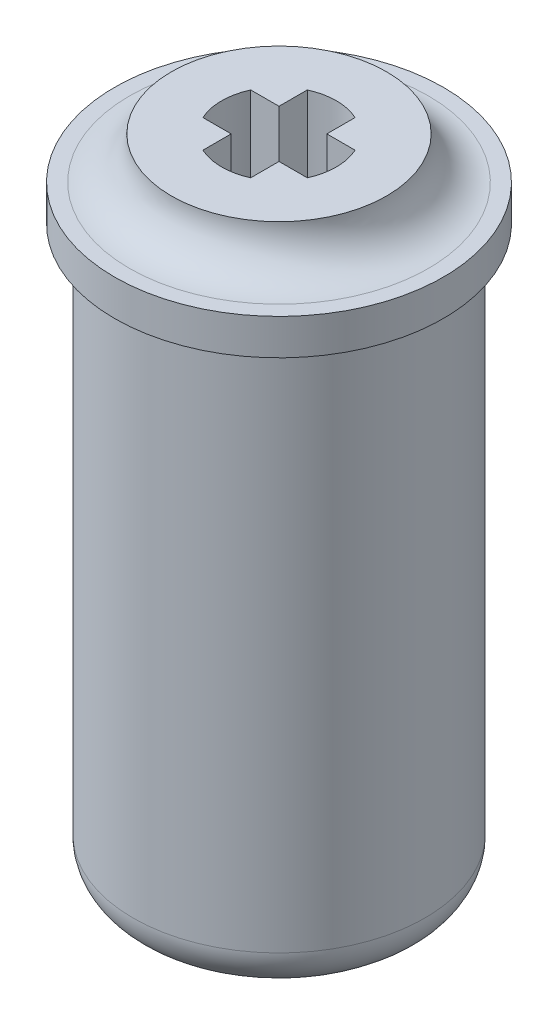
ISO-10303-21;
HEADER;
FILE_DESCRIPTION(('STEP AP214'),'2;1');
FILE_NAME('part.step','',(''),(''),'','','');
FILE_SCHEMA(('AUTOMOTIVE_DESIGN { 1 0 10303 214 1 1 1 1 }'));
ENDSEC;
DATA;
#1=APPLICATION_CONTEXT('core data for automotive mechanical design processes');
#2=APPLICATION_PROTOCOL_DEFINITION('international standard','automotive_design',2000,#1);
#3=PRODUCT_CONTEXT('',#1,'mechanical');
#4=PRODUCT('Part','Part','',(#3));
#5=PRODUCT_RELATED_PRODUCT_CATEGORY('part','',(#4));
#6=PRODUCT_DEFINITION_FORMATION('','',#4);
#7=PRODUCT_DEFINITION_CONTEXT('part definition',#1,'design');
#8=PRODUCT_DEFINITION('design','',#6,#7);
#9=PRODUCT_DEFINITION_SHAPE('','',#8);
#10=(LENGTH_UNIT() NAMED_UNIT(*) SI_UNIT(.MILLI.,.METRE.));
#11=(NAMED_UNIT(*) PLANE_ANGLE_UNIT() SI_UNIT($,.RADIAN.));
#12=(NAMED_UNIT(*) SI_UNIT($,.STERADIAN.) SOLID_ANGLE_UNIT());
#13=UNCERTAINTY_MEASURE_WITH_UNIT(LENGTH_MEASURE(1.E-05),#10,'distance_accuracy_value','');
#14=(GEOMETRIC_REPRESENTATION_CONTEXT(3) GLOBAL_UNCERTAINTY_ASSIGNED_CONTEXT((#13)) GLOBAL_UNIT_ASSIGNED_CONTEXT((#10,
#11,#12)) REPRESENTATION_CONTEXT('',''));
#15=CARTESIAN_POINT('',(0.,0.,0.));
#16=DIRECTION('',(0.,0.,1.));
#17=DIRECTION('',(1.,0.,0.));
#18=AXIS2_PLACEMENT_3D('',#15,#16,#17);
#19=CARTESIAN_POINT('',(1.59087121146357,-25.25,1.59087121146357));
#20=DIRECTION('',(0.,-1.,0.));
#21=DIRECTION('',(0.,0.,-1.));
#22=AXIS2_PLACEMENT_3D('',#19,#20,#21);
#23=PLANE('',#22);
#24=CARTESIAN_POINT('',(0.,-25.25,0.));
#25=DIRECTION('',(0.,-1.,0.));
#26=DIRECTION('',(0.,0.,-1.));
#27=AXIS2_PLACEMENT_3D('',#24,#25,#26);
#28=CIRCLE('',#27,2.4);
#29=CARTESIAN_POINT('',(2.18174242292714,-25.25,1.));
#30=VERTEX_POINT('',#29);
#31=CARTESIAN_POINT('',(0.999999999999999,-25.25,2.18174242292714));
#32=VERTEX_POINT('',#31);
#33=EDGE_CURVE('E218',#30,#32,#28,.T.);
#34=ORIENTED_EDGE('',*,*,#33,.T.);
#35=DIRECTION('',(0.,0.,-1.));
#36=VECTOR('',#35,1.);
#37=CARTESIAN_POINT('',(1.,-25.25,1.));
#38=LINE('',#37,#36);
#39=CARTESIAN_POINT('',(1.,-25.25,1.));
#40=VERTEX_POINT('',#39);
#41=EDGE_CURVE('E210',#32,#40,#38,.T.);
#42=ORIENTED_EDGE('',*,*,#41,.T.);
#43=DIRECTION('',(1.,0.,0.));
#44=VECTOR('',#43,1.);
#45=CARTESIAN_POINT('',(2.18174242292714,-25.25,1.));
#46=LINE('',#45,#44);
#47=EDGE_CURVE('E222',#40,#30,#46,.T.);
#48=ORIENTED_EDGE('',*,*,#47,.T.);
#49=EDGE_LOOP('',(#34,#42,#48));
#50=FACE_BOUND('',#49,.T.);
#51=ADVANCED_FACE('F16',(#50),#23,.T.);
#52=CARTESIAN_POINT('',(1.,1.75,1.));
#53=DIRECTION('',(1.,0.,0.));
#54=DIRECTION('',(0.,0.,-1.));
#55=AXIS2_PLACEMENT_3D('',#52,#53,#54);
#56=PLANE('',#55);
#57=DIRECTION('',(0.,-1.,0.));
#58=VECTOR('',#57,1.);
#59=CARTESIAN_POINT('',(0.999999999999998,1.75,2.18174242292715));
#60=LINE('',#59,#58);
#61=CARTESIAN_POINT('',(0.999999999999999,1.75,2.18174242292714));
#62=VERTEX_POINT('',#61);
#63=EDGE_CURVE('E216',#32,#62,#60,.F.);
#64=ORIENTED_EDGE('',*,*,#63,.T.);
#65=DIRECTION('',(0.,0.,1.));
#66=VECTOR('',#65,1.);
#67=CARTESIAN_POINT('',(1.,1.75,0.));
#68=LINE('',#67,#66);
#69=CARTESIAN_POINT('',(1.,1.75,1.));
#70=VERTEX_POINT('',#69);
#71=EDGE_CURVE('E126',#70,#62,#68,.T.);
#72=ORIENTED_EDGE('',*,*,#71,.F.);
#73=DIRECTION('',(0.,1.,0.));
#74=VECTOR('',#73,1.);
#75=CARTESIAN_POINT('',(1.,1.75,1.));
#76=LINE('',#75,#74);
#77=EDGE_CURVE('E225',#70,#40,#76,.F.);
#78=ORIENTED_EDGE('',*,*,#77,.T.);
#79=ORIENTED_EDGE('',*,*,#41,.F.);
#80=EDGE_LOOP('',(#64,#72,#78,#79));
#81=FACE_BOUND('',#80,.T.);
#82=ADVANCED_FACE('F374',(#81),#56,.F.);
#83=CARTESIAN_POINT('',(-1.,1.75,2.18174242292714));
#84=DIRECTION('',(-1.,0.,0.));
#85=DIRECTION('',(0.,0.,1.));
#86=AXIS2_PLACEMENT_3D('',#83,#84,#85);
#87=PLANE('',#86);
#88=DIRECTION('',(0.,1.,0.));
#89=VECTOR('',#88,1.);
#90=CARTESIAN_POINT('',(-1.,1.75,1.));
#91=LINE('',#90,#89);
#92=CARTESIAN_POINT('',(-1.,-25.25,1.));
#93=VERTEX_POINT('',#92);
#94=CARTESIAN_POINT('',(-1.,1.75,1.));
#95=VERTEX_POINT('',#94);
#96=EDGE_CURVE('E204',#93,#95,#91,.T.);
#97=ORIENTED_EDGE('',*,*,#96,.T.);
#98=DIRECTION('',(0.,0.,1.));
#99=VECTOR('',#98,1.);
#100=CARTESIAN_POINT('',(-1.,1.75,0.));
#101=LINE('',#100,#99);
#102=CARTESIAN_POINT('',(-1.,1.75,2.18174242292714));
#103=VERTEX_POINT('',#102);
#104=EDGE_CURVE('E173',#103,#95,#101,.F.);
#105=ORIENTED_EDGE('',*,*,#104,.F.);
#106=DIRECTION('',(0.,-1.,0.));
#107=VECTOR('',#106,1.);
#108=CARTESIAN_POINT('',(-1.,1.75,2.18174242292714));
#109=LINE('',#108,#107);
#110=CARTESIAN_POINT('',(-1.,-25.25,2.18174242292714));
#111=VERTEX_POINT('',#110);
#112=EDGE_CURVE('E213',#103,#111,#109,.T.);
#113=ORIENTED_EDGE('',*,*,#112,.T.);
#114=DIRECTION('',(0.,0.,-1.));
#115=VECTOR('',#114,1.);
#116=CARTESIAN_POINT('',(-1.,-25.25,1.59087121146357));
#117=LINE('',#116,#115);
#118=EDGE_CURVE('E207',#93,#111,#117,.F.);
#119=ORIENTED_EDGE('',*,*,#118,.F.);
#120=EDGE_LOOP('',(#97,#105,#113,#119));
#121=FACE_BOUND('',#120,.T.);
#122=ADVANCED_FACE('F370',(#121),#87,.F.);
#123=CARTESIAN_POINT('',(-1.59087121146357,-25.25,1.59087121146357));
#124=DIRECTION('',(0.,-1.,0.));
#125=DIRECTION('',(0.,0.,-1.));
#126=AXIS2_PLACEMENT_3D('',#123,#124,#125);
#127=PLANE('',#126);
#128=CARTESIAN_POINT('',(0.,-25.25,0.));
#129=DIRECTION('',(0.,-1.,0.));
#130=DIRECTION('',(0.,0.,-1.));
#131=AXIS2_PLACEMENT_3D('',#128,#129,#130);
#132=CIRCLE('',#131,2.4);
#133=CARTESIAN_POINT('',(-2.18174242292714,-25.25,1.));
#134=VERTEX_POINT('',#133);
#135=EDGE_CURVE('E201',#111,#134,#132,.T.);
#136=ORIENTED_EDGE('',*,*,#135,.T.);
#137=DIRECTION('',(1.,0.,0.));
#138=VECTOR('',#137,1.);
#139=CARTESIAN_POINT('',(-1.,-25.25,1.));
#140=LINE('',#139,#138);
#141=EDGE_CURVE('E193',#134,#93,#140,.T.);
#142=ORIENTED_EDGE('',*,*,#141,.T.);
#143=ORIENTED_EDGE('',*,*,#118,.T.);
#144=EDGE_LOOP('',(#136,#142,#143));
#145=FACE_BOUND('',#144,.T.);
#146=ADVANCED_FACE('F368',(#145),#127,.T.);
#147=CARTESIAN_POINT('',(-1.,1.75,1.));
#148=DIRECTION('',(0.,0.,1.));
#149=DIRECTION('',(1.,0.,0.));
#150=AXIS2_PLACEMENT_3D('',#147,#148,#149);
#151=PLANE('',#150);
#152=DIRECTION('',(0.,-1.,0.));
#153=VECTOR('',#152,1.);
#154=CARTESIAN_POINT('',(-2.18174242292714,1.75,1.));
#155=LINE('',#154,#153);
#156=CARTESIAN_POINT('',(-2.18174242292714,1.75,1.));
#157=VERTEX_POINT('',#156);
#158=EDGE_CURVE('E199',#134,#157,#155,.F.);
#159=ORIENTED_EDGE('',*,*,#158,.T.);
#160=DIRECTION('',(1.,0.,0.));
#161=VECTOR('',#160,1.);
#162=CARTESIAN_POINT('',(0.,1.75,1.));
#163=LINE('',#162,#161);
#164=EDGE_CURVE('E168',#95,#157,#163,.F.);
#165=ORIENTED_EDGE('',*,*,#164,.F.);
#166=ORIENTED_EDGE('',*,*,#96,.F.);
#167=ORIENTED_EDGE('',*,*,#141,.F.);
#168=EDGE_LOOP('',(#159,#165,#166,#167));
#169=FACE_BOUND('',#168,.T.);
#170=ADVANCED_FACE('F362',(#169),#151,.F.);
#171=CARTESIAN_POINT('',(-2.18174242292714,1.75,-1.));
#172=DIRECTION('',(0.,0.,-1.));
#173=DIRECTION('',(-1.,0.,0.));
#174=AXIS2_PLACEMENT_3D('',#171,#172,#173);
#175=PLANE('',#174);
#176=DIRECTION('',(0.,1.,0.));
#177=VECTOR('',#176,1.);
#178=CARTESIAN_POINT('',(-1.,1.75,-1.));
#179=LINE('',#178,#177);
#180=CARTESIAN_POINT('',(-1.,-25.25,-1.));
#181=VERTEX_POINT('',#180);
#182=CARTESIAN_POINT('',(-1.,1.75,-1.));
#183=VERTEX_POINT('',#182);
#184=EDGE_CURVE('E187',#181,#183,#179,.T.);
#185=ORIENTED_EDGE('',*,*,#184,.T.);
#186=DIRECTION('',(1.,0.,0.));
#187=VECTOR('',#186,1.);
#188=CARTESIAN_POINT('',(0.,1.75,-1.));
#189=LINE('',#188,#187);
#190=CARTESIAN_POINT('',(-2.18174242292714,1.75,-1.));
#191=VERTEX_POINT('',#190);
#192=EDGE_CURVE('E163',#191,#183,#189,.T.);
#193=ORIENTED_EDGE('',*,*,#192,.F.);
#194=DIRECTION('',(0.,-1.,0.));
#195=VECTOR('',#194,1.);
#196=CARTESIAN_POINT('',(-2.18174242292714,1.75,-1.));
#197=LINE('',#196,#195);
#198=CARTESIAN_POINT('',(-2.18174242292714,-25.25,-1.));
#199=VERTEX_POINT('',#198);
#200=EDGE_CURVE('E196',#191,#199,#197,.T.);
#201=ORIENTED_EDGE('',*,*,#200,.T.);
#202=DIRECTION('',(1.,0.,0.));
#203=VECTOR('',#202,1.);
#204=CARTESIAN_POINT('',(-1.59087121146357,-25.25,-1.));
#205=LINE('',#204,#203);
#206=EDGE_CURVE('E190',#181,#199,#205,.F.);
#207=ORIENTED_EDGE('',*,*,#206,.F.);
#208=EDGE_LOOP('',(#185,#193,#201,#207));
#209=FACE_BOUND('',#208,.T.);
#210=ADVANCED_FACE('F358',(#209),#175,.F.);
#211=CARTESIAN_POINT('',(-1.59087121146357,-25.25,-1.59087121146357));
#212=DIRECTION('',(0.,-1.,0.));
#213=DIRECTION('',(0.,0.,-1.));
#214=AXIS2_PLACEMENT_3D('',#211,#212,#213);
#215=PLANE('',#214);
#216=CARTESIAN_POINT('',(0.,-25.25,0.));
#217=DIRECTION('',(0.,-1.,0.));
#218=DIRECTION('',(0.,0.,-1.));
#219=AXIS2_PLACEMENT_3D('',#216,#217,#218);
#220=CIRCLE('',#219,2.4);
#221=CARTESIAN_POINT('',(-1.,-25.25,-2.18174242292714));
#222=VERTEX_POINT('',#221);
#223=EDGE_CURVE('E184',#199,#222,#220,.T.);
#224=ORIENTED_EDGE('',*,*,#223,.T.);
#225=DIRECTION('',(0.,0.,1.));
#226=VECTOR('',#225,1.);
#227=CARTESIAN_POINT('',(-1.,-25.25,-1.));
#228=LINE('',#227,#226);
#229=EDGE_CURVE('E178',#222,#181,#228,.T.);
#230=ORIENTED_EDGE('',*,*,#229,.T.);
#231=ORIENTED_EDGE('',*,*,#206,.T.);
#232=EDGE_LOOP('',(#224,#230,#231));
#233=FACE_BOUND('',#232,.T.);
#234=ADVANCED_FACE('F353',(#233),#215,.T.);
#235=CARTESIAN_POINT('',(-1.,1.75,-1.));
#236=DIRECTION('',(-1.,0.,0.));
#237=DIRECTION('',(0.,0.,1.));
#238=AXIS2_PLACEMENT_3D('',#235,#236,#237);
#239=PLANE('',#238);
#240=DIRECTION('',(0.,-1.,0.));
#241=VECTOR('',#240,1.);
#242=CARTESIAN_POINT('',(-1.,1.75,-2.18174242292714));
#243=LINE('',#242,#241);
#244=CARTESIAN_POINT('',(-1.,1.75,-2.18174242292714));
#245=VERTEX_POINT('',#244);
#246=EDGE_CURVE('E181',#222,#245,#243,.F.);
#247=ORIENTED_EDGE('',*,*,#246,.T.);
#248=DIRECTION('',(0.,0.,1.));
#249=VECTOR('',#248,1.);
#250=CARTESIAN_POINT('',(-1.,1.75,0.));
#251=LINE('',#250,#249);
#252=EDGE_CURVE('E127',#183,#245,#251,.F.);
#253=ORIENTED_EDGE('',*,*,#252,.F.);
#254=ORIENTED_EDGE('',*,*,#184,.F.);
#255=ORIENTED_EDGE('',*,*,#229,.F.);
#256=EDGE_LOOP('',(#247,#253,#254,#255));
#257=FACE_BOUND('',#256,.T.);
#258=ADVANCED_FACE('F350',(#257),#239,.F.);
#259=CARTESIAN_POINT('',(0.,1.75,0.));
#260=DIRECTION('',(0.,1.,0.));
#261=DIRECTION('',(0.,0.,1.));
#262=AXIS2_PLACEMENT_3D('',#259,#260,#261);
#263=PLANE('',#262);
#264=ORIENTED_EDGE('',*,*,#71,.T.);
#265=CARTESIAN_POINT('',(0.,1.75,0.));
#266=DIRECTION('',(0.,-1.,0.));
#267=DIRECTION('',(0.,0.,-1.));
#268=AXIS2_PLACEMENT_3D('',#265,#266,#267);
#269=CIRCLE('',#268,2.4);
#270=EDGE_CURVE('E215',#62,#103,#269,.T.);
#271=ORIENTED_EDGE('',*,*,#270,.T.);
#272=ORIENTED_EDGE('',*,*,#104,.T.);
#273=ORIENTED_EDGE('',*,*,#164,.T.);
#274=CARTESIAN_POINT('',(0.,1.75,0.));
#275=DIRECTION('',(0.,-1.,0.));
#276=DIRECTION('',(0.,0.,-1.));
#277=AXIS2_PLACEMENT_3D('',#274,#275,#276);
#278=CIRCLE('',#277,2.4);
#279=EDGE_CURVE('E198',#157,#191,#278,.T.);
#280=ORIENTED_EDGE('',*,*,#279,.T.);
#281=ORIENTED_EDGE('',*,*,#192,.T.);
#282=ORIENTED_EDGE('',*,*,#252,.T.);
#283=CARTESIAN_POINT('',(0.,1.75,0.));
#284=DIRECTION('',(0.,-1.,0.));
#285=DIRECTION('',(0.,0.,-1.));
#286=AXIS2_PLACEMENT_3D('',#283,#284,#285);
#287=CIRCLE('',#286,2.4);
#288=CARTESIAN_POINT('',(1.,1.75,-2.18174242292714));
#289=VERTEX_POINT('',#288);
#290=EDGE_CURVE('E183',#245,#289,#287,.T.);
#291=ORIENTED_EDGE('',*,*,#290,.T.);
#292=DIRECTION('',(0.,0.,-1.));
#293=VECTOR('',#292,1.);
#294=CARTESIAN_POINT('',(1.,1.75,-2.18174242292714));
#295=LINE('',#294,#293);
#296=CARTESIAN_POINT('',(1.,1.75,-1.));
#297=VERTEX_POINT('',#296);
#298=EDGE_CURVE('E134',#289,#297,#295,.F.);
#299=ORIENTED_EDGE('',*,*,#298,.T.);
#300=DIRECTION('',(-1.,0.,0.));
#301=VECTOR('',#300,1.);
#302=CARTESIAN_POINT('',(1.,1.75,-1.));
#303=LINE('',#302,#301);
#304=CARTESIAN_POINT('',(2.18174242292714,1.75,-1.));
#305=VERTEX_POINT('',#304);
#306=EDGE_CURVE('E129',#297,#305,#303,.F.);
#307=ORIENTED_EDGE('',*,*,#306,.T.);
#308=CARTESIAN_POINT('',(0.,1.75,0.));
#309=DIRECTION('',(0.,-1.,0.));
#310=DIRECTION('',(0.,0.,-1.));
#311=AXIS2_PLACEMENT_3D('',#308,#309,#310);
#312=CIRCLE('',#311,2.4);
#313=CARTESIAN_POINT('',(2.18174242292714,1.75,1.));
#314=VERTEX_POINT('',#313);
#315=EDGE_CURVE('E19',#305,#314,#312,.T.);
#316=ORIENTED_EDGE('',*,*,#315,.T.);
#317=DIRECTION('',(1.,0.,0.));
#318=VECTOR('',#317,1.);
#319=CARTESIAN_POINT('',(2.18174242292714,1.75,1.));
#320=LINE('',#319,#318);
#321=EDGE_CURVE('E230',#314,#70,#320,.F.);
#322=ORIENTED_EDGE('',*,*,#321,.T.);
#323=EDGE_LOOP('',(#264,#271,#272,#273,#280,#281,#282,#291,#299,#307,#316,#322));
#324=FACE_BOUND('',#323,.T.);
#325=CARTESIAN_POINT('',(0.,1.75,0.));
#326=DIRECTION('',(0.,1.,0.));
#327=DIRECTION('',(0.,0.,1.));
#328=AXIS2_PLACEMENT_3D('',#325,#326,#327);
#329=CIRCLE('',#328,4.49999999999999);
#330=CARTESIAN_POINT('',(0.,1.75,4.49999999999999));
#331=VERTEX_POINT('',#330);
#332=EDGE_CURVE('E224',#331,#331,#329,.T.);
#333=ORIENTED_EDGE('',*,*,#332,.T.);
#334=EDGE_LOOP('',(#333));
#335=FACE_BOUND('',#334,.T.);
#336=ADVANCED_FACE('F131',(#324,#335),#263,.T.);
#337=CARTESIAN_POINT('',(1.,1.75,-2.18174242292714));
#338=DIRECTION('',(1.,0.,0.));
#339=DIRECTION('',(0.,0.,-1.));
#340=AXIS2_PLACEMENT_3D('',#337,#338,#339);
#341=PLANE('',#340);
#342=DIRECTION('',(0.,1.,0.));
#343=VECTOR('',#342,1.);
#344=CARTESIAN_POINT('',(1.,1.75,-1.));
#345=LINE('',#344,#343);
#346=CARTESIAN_POINT('',(1.,-25.25,-1.));
#347=VERTEX_POINT('',#346);
#348=EDGE_CURVE('E139',#347,#297,#345,.T.);
#349=ORIENTED_EDGE('',*,*,#348,.T.);
#350=ORIENTED_EDGE('',*,*,#298,.F.);
#351=DIRECTION('',(0.,-1.,0.));
#352=VECTOR('',#351,1.);
#353=CARTESIAN_POINT('',(1.,1.75,-2.18174242292714));
#354=LINE('',#353,#352);
#355=CARTESIAN_POINT('',(1.,-25.25,-2.18174242292714));
#356=VERTEX_POINT('',#355);
#357=EDGE_CURVE('E148',#289,#356,#354,.T.);
#358=ORIENTED_EDGE('',*,*,#357,.T.);
#359=DIRECTION('',(0.,0.,-1.));
#360=VECTOR('',#359,1.);
#361=CARTESIAN_POINT('',(1.,-25.25,-1.59087121146357));
#362=LINE('',#361,#360);
#363=EDGE_CURVE('E155',#347,#356,#362,.T.);
#364=ORIENTED_EDGE('',*,*,#363,.F.);
#365=EDGE_LOOP('',(#349,#350,#358,#364));
#366=FACE_BOUND('',#365,.T.);
#367=ADVANCED_FACE('F342',(#366),#341,.F.);
#368=CARTESIAN_POINT('',(1.59087121146357,-25.25,-1.59087121146357));
#369=DIRECTION('',(0.,-1.,0.));
#370=DIRECTION('',(0.,0.,-1.));
#371=AXIS2_PLACEMENT_3D('',#368,#369,#370);
#372=PLANE('',#371);
#373=CARTESIAN_POINT('',(0.,-25.25,0.));
#374=DIRECTION('',(0.,-1.,0.));
#375=DIRECTION('',(0.,0.,-1.));
#376=AXIS2_PLACEMENT_3D('',#373,#374,#375);
#377=CIRCLE('',#376,2.4);
#378=CARTESIAN_POINT('',(2.18174242292714,-25.25,-1.));
#379=VERTEX_POINT('',#378);
#380=EDGE_CURVE('E144',#356,#379,#377,.T.);
#381=ORIENTED_EDGE('',*,*,#380,.T.);
#382=DIRECTION('',(-1.,0.,0.));
#383=VECTOR('',#382,1.);
#384=CARTESIAN_POINT('',(1.,-25.25,-1.));
#385=LINE('',#384,#383);
#386=EDGE_CURVE('E138',#379,#347,#385,.T.);
#387=ORIENTED_EDGE('',*,*,#386,.T.);
#388=ORIENTED_EDGE('',*,*,#363,.T.);
#389=EDGE_LOOP('',(#381,#387,#388));
#390=FACE_BOUND('',#389,.T.);
#391=ADVANCED_FACE('F340',(#390),#372,.T.);
#392=CARTESIAN_POINT('',(1.,1.75,-1.));
#393=DIRECTION('',(0.,0.,-1.));
#394=DIRECTION('',(-1.,0.,0.));
#395=AXIS2_PLACEMENT_3D('',#392,#393,#394);
#396=PLANE('',#395);
#397=DIRECTION('',(0.,-1.,0.));
#398=VECTOR('',#397,1.);
#399=CARTESIAN_POINT('',(2.18174242292714,1.75,-1.));
#400=LINE('',#399,#398);
#401=EDGE_CURVE('E122',#379,#305,#400,.F.);
#402=ORIENTED_EDGE('',*,*,#401,.T.);
#403=ORIENTED_EDGE('',*,*,#306,.F.);
#404=ORIENTED_EDGE('',*,*,#348,.F.);
#405=ORIENTED_EDGE('',*,*,#386,.F.);
#406=EDGE_LOOP('',(#402,#403,#404,#405));
#407=FACE_BOUND('',#406,.T.);
#408=ADVANCED_FACE('F142',(#407),#396,.F.);
#409=CARTESIAN_POINT('',(2.18174242292714,1.75,1.));
#410=DIRECTION('',(0.,0.,1.));
#411=DIRECTION('',(1.,0.,0.));
#412=AXIS2_PLACEMENT_3D('',#409,#410,#411);
#413=PLANE('',#412);
#414=ORIENTED_EDGE('',*,*,#77,.F.);
#415=ORIENTED_EDGE('',*,*,#321,.F.);
#416=DIRECTION('',(0.,-1.,0.));
#417=VECTOR('',#416,1.);
#418=CARTESIAN_POINT('',(2.18174242292714,1.75,1.));
#419=LINE('',#418,#417);
#420=EDGE_CURVE('E125',#314,#30,#419,.T.);
#421=ORIENTED_EDGE('',*,*,#420,.T.);
#422=ORIENTED_EDGE('',*,*,#47,.F.);
#423=EDGE_LOOP('',(#414,#415,#421,#422));
#424=FACE_BOUND('',#423,.T.);
#425=ADVANCED_FACE('F271',(#424),#413,.F.);
#426=CARTESIAN_POINT('',(0.,1.75,0.));
#427=DIRECTION('',(0.,1.,0.));
#428=DIRECTION('',(0.,0.,1.));
#429=AXIS2_PLACEMENT_3D('',#426,#427,#428);
#430=TOROIDAL_SURFACE('',#429,6.24999999999999,1.75);
#431=ORIENTED_EDGE('',*,*,#332,.F.);
#432=EDGE_LOOP('',(#431));
#433=FACE_BOUND('',#432,.T.);
#434=CARTESIAN_POINT('',(0.,0.,0.));
#435=DIRECTION('',(0.,1.,0.));
#436=DIRECTION('',(-1.,0.,0.));
#437=AXIS2_PLACEMENT_3D('',#434,#435,#436);
#438=CIRCLE('',#437,6.24999999999999);
#439=CARTESIAN_POINT('',(-6.24999999999999,0.,0.));
#440=VERTEX_POINT('',#439);
#441=CARTESIAN_POINT('',(0.,0.,-6.24999999999999));
#442=VERTEX_POINT('',#441);
#443=EDGE_CURVE('E256',#440,#442,#438,.T.);
#444=ORIENTED_EDGE('',*,*,#443,.T.);
#445=CARTESIAN_POINT('',(0.,0.,0.));
#446=DIRECTION('',(0.,1.,0.));
#447=DIRECTION('',(0.,0.,-1.));
#448=AXIS2_PLACEMENT_3D('',#445,#446,#447);
#449=CIRCLE('',#448,6.24999999999999);
#450=EDGE_CURVE('E146',#442,#440,#449,.T.);
#451=ORIENTED_EDGE('',*,*,#450,.T.);
#452=EDGE_LOOP('',(#444,#451));
#453=FACE_BOUND('',#452,.T.);
#454=ADVANCED_FACE('F268',(#433,#453),#430,.F.);
#455=CARTESIAN_POINT('',(0.,1.75,0.));
#456=DIRECTION('',(0.,-1.,0.));
#457=DIRECTION('',(0.,0.,-1.));
#458=AXIS2_PLACEMENT_3D('',#455,#456,#457);
#459=CYLINDRICAL_SURFACE('',#458,2.4);
#460=CARTESIAN_POINT('',(0.,-25.35,0.));
#461=DIRECTION('',(0.,-1.,0.));
#462=DIRECTION('',(0.,0.,-1.));
#463=AXIS2_PLACEMENT_3D('',#460,#461,#462);
#464=CIRCLE('',#463,2.4);
#465=CARTESIAN_POINT('',(0.,-25.35,-2.4));
#466=VERTEX_POINT('',#465);
#467=EDGE_CURVE('E254',#466,#466,#464,.F.);
#468=ORIENTED_EDGE('',*,*,#467,.F.);
#469=EDGE_LOOP('',(#468));
#470=FACE_BOUND('',#469,.T.);
#471=ORIENTED_EDGE('',*,*,#315,.F.);
#472=ORIENTED_EDGE('',*,*,#401,.F.);
#473=ORIENTED_EDGE('',*,*,#380,.F.);
#474=ORIENTED_EDGE('',*,*,#357,.F.);
#475=ORIENTED_EDGE('',*,*,#290,.F.);
#476=ORIENTED_EDGE('',*,*,#246,.F.);
#477=ORIENTED_EDGE('',*,*,#223,.F.);
#478=ORIENTED_EDGE('',*,*,#200,.F.);
#479=ORIENTED_EDGE('',*,*,#279,.F.);
#480=ORIENTED_EDGE('',*,*,#158,.F.);
#481=ORIENTED_EDGE('',*,*,#135,.F.);
#482=ORIENTED_EDGE('',*,*,#112,.F.);
#483=ORIENTED_EDGE('',*,*,#270,.F.);
#484=ORIENTED_EDGE('',*,*,#63,.F.);
#485=ORIENTED_EDGE('',*,*,#33,.F.);
#486=ORIENTED_EDGE('',*,*,#420,.F.);
#487=EDGE_LOOP('',(#471,#472,#473,#474,#475,#476,#477,#478,#479,#480,#481,#482,#483,#484,#485,#486));
#488=FACE_BOUND('',#487,.T.);
#489=ADVANCED_FACE('F119',(#470,#488),#459,.F.);
#490=CARTESIAN_POINT('',(0.,0.,0.));
#491=DIRECTION('',(0.,-1.,0.));
#492=DIRECTION('',(0.,0.,-1.));
#493=AXIS2_PLACEMENT_3D('',#490,#491,#492);
#494=PLANE('',#493);
#495=ORIENTED_EDGE('',*,*,#450,.F.);
#496=ORIENTED_EDGE('',*,*,#443,.F.);
#497=EDGE_LOOP('',(#495,#496));
#498=FACE_BOUND('',#497,.T.);
#499=CARTESIAN_POINT('',(0.,0.,0.));
#500=DIRECTION('',(0.,-1.,0.));
#501=DIRECTION('',(0.,0.,-1.));
#502=AXIS2_PLACEMENT_3D('',#499,#500,#501);
#503=CIRCLE('',#502,6.87500000000001);
#504=CARTESIAN_POINT('',(0.,0.,-6.87500000000001));
#505=VERTEX_POINT('',#504);
#506=EDGE_CURVE('E250',#505,#505,#503,.T.);
#507=ORIENTED_EDGE('',*,*,#506,.F.);
#508=EDGE_LOOP('',(#507));
#509=FACE_BOUND('',#508,.T.);
#510=ADVANCED_FACE('F282',(#498,#509),#494,.F.);
#511=CARTESIAN_POINT('',(0.,-25.35,0.));
#512=DIRECTION('',(0.,-1.,0.));
#513=DIRECTION('',(0.,0.,-1.));
#514=AXIS2_PLACEMENT_3D('',#511,#512,#513);
#515=PLANE('',#514);
#516=ORIENTED_EDGE('',*,*,#467,.T.);
#517=EDGE_LOOP('',(#516));
#518=FACE_BOUND('',#517,.T.);
#519=CARTESIAN_POINT('',(0.,-25.35,0.));
#520=DIRECTION('',(0.,1.,0.));
#521=DIRECTION('',(-1.,0.,0.));
#522=AXIS2_PLACEMENT_3D('',#519,#520,#521);
#523=CIRCLE('',#522,4.35);
#524=CARTESIAN_POINT('',(-4.35,-25.35,0.));
#525=VERTEX_POINT('',#524);
#526=CARTESIAN_POINT('',(0.,-25.35,4.35));
#527=VERTEX_POINT('',#526);
#528=EDGE_CURVE('E33',#525,#527,#523,.T.);
#529=ORIENTED_EDGE('',*,*,#528,.F.);
#530=CARTESIAN_POINT('',(0.,-25.35,0.));
#531=DIRECTION('',(0.,1.,0.));
#532=DIRECTION('',(0.,0.,1.));
#533=AXIS2_PLACEMENT_3D('',#530,#531,#532);
#534=CIRCLE('',#533,4.35);
#535=EDGE_CURVE('E253',#527,#525,#534,.T.);
#536=ORIENTED_EDGE('',*,*,#535,.F.);
#537=EDGE_LOOP('',(#529,#536));
#538=FACE_BOUND('',#537,.T.);
#539=ADVANCED_FACE('F303',(#518,#538),#515,.T.);
#540=CARTESIAN_POINT('',(0.,0.,0.));
#541=DIRECTION('',(0.,-1.,0.));
#542=DIRECTION('',(0.,0.,-1.));
#543=AXIS2_PLACEMENT_3D('',#540,#541,#542);
#544=CYLINDRICAL_SURFACE('',#543,6.87500000000001);
#545=ORIENTED_EDGE('',*,*,#506,.T.);
#546=EDGE_LOOP('',(#545));
#547=FACE_BOUND('',#546,.T.);
#548=CARTESIAN_POINT('',(0.,-1.5,0.));
#549=DIRECTION('',(0.,-1.,0.));
#550=DIRECTION('',(0.,0.,-1.));
#551=AXIS2_PLACEMENT_3D('',#548,#549,#550);
#552=CIRCLE('',#551,6.87500000000001);
#553=CARTESIAN_POINT('',(0.,-1.5,-6.87500000000001));
#554=VERTEX_POINT('',#553);
#555=EDGE_CURVE('E247',#554,#554,#552,.T.);
#556=ORIENTED_EDGE('',*,*,#555,.F.);
#557=EDGE_LOOP('',(#556));
#558=FACE_BOUND('',#557,.T.);
#559=ADVANCED_FACE('F399',(#547,#558),#544,.T.);
#560=CARTESIAN_POINT('',(0.,-23.6,0.));
#561=DIRECTION('',(0.,-1.,0.));
#562=DIRECTION('',(0.,0.,-1.));
#563=AXIS2_PLACEMENT_3D('',#560,#561,#562);
#564=TOROIDAL_SURFACE('',#563,4.35,1.75);
#565=CARTESIAN_POINT('',(0.,-23.6,0.));
#566=DIRECTION('',(0.,-1.,0.));
#567=DIRECTION('',(0.,0.,-1.));
#568=AXIS2_PLACEMENT_3D('',#565,#566,#567);
#569=CIRCLE('',#568,6.10000000000001);
#570=CARTESIAN_POINT('',(0.,-23.6,-6.10000000000001));
#571=VERTEX_POINT('',#570);
#572=EDGE_CURVE('E25',#571,#571,#569,.F.);
#573=ORIENTED_EDGE('',*,*,#572,.F.);
#574=EDGE_LOOP('',(#573));
#575=FACE_BOUND('',#574,.T.);
#576=ORIENTED_EDGE('',*,*,#528,.T.);
#577=ORIENTED_EDGE('',*,*,#535,.T.);
#578=EDGE_LOOP('',(#576,#577));
#579=FACE_BOUND('',#578,.T.);
#580=ADVANCED_FACE('F392',(#575,#579),#564,.T.);
#581=CARTESIAN_POINT('',(0.,-1.5,0.));
#582=DIRECTION('',(0.,-1.,0.));
#583=DIRECTION('',(0.,0.,-1.));
#584=AXIS2_PLACEMENT_3D('',#581,#582,#583);
#585=PLANE('',#584);
#586=CARTESIAN_POINT('',(0.,-1.5,0.));
#587=DIRECTION('',(0.,-1.,0.));
#588=DIRECTION('',(0.,0.,-1.));
#589=AXIS2_PLACEMENT_3D('',#586,#587,#588);
#590=CIRCLE('',#589,6.10000000000001);
#591=CARTESIAN_POINT('',(0.,-1.5,-6.10000000000001));
#592=VERTEX_POINT('',#591);
#593=EDGE_CURVE('E11',#592,#592,#590,.T.);
#594=ORIENTED_EDGE('',*,*,#593,.F.);
#595=EDGE_LOOP('',(#594));
#596=FACE_BOUND('',#595,.T.);
#597=ORIENTED_EDGE('',*,*,#555,.T.);
#598=EDGE_LOOP('',(#597));
#599=FACE_BOUND('',#598,.T.);
#600=ADVANCED_FACE('F386',(#596,#599),#585,.T.);
#601=CARTESIAN_POINT('',(0.,-1.5,0.));
#602=DIRECTION('',(0.,-1.,0.));
#603=DIRECTION('',(0.,0.,-1.));
#604=AXIS2_PLACEMENT_3D('',#601,#602,#603);
#605=CYLINDRICAL_SURFACE('',#604,6.10000000000001);
#606=ORIENTED_EDGE('',*,*,#593,.T.);
#607=EDGE_LOOP('',(#606));
#608=FACE_BOUND('',#607,.T.);
#609=ORIENTED_EDGE('',*,*,#572,.T.);
#610=EDGE_LOOP('',(#609));
#611=FACE_BOUND('',#610,.T.);
#612=ADVANCED_FACE('F384',(#608,#611),#605,.T.);
#613=CLOSED_SHELL('',(#51,#82,#122,#146,#170,#210,#234,#258,#336,#367,#391,#408,#425,#454,#489,
#510,#539,#559,#580,#600,#612));
#614=MANIFOLD_SOLID_BREP('B1',#613);
#615=ADVANCED_BREP_SHAPE_REPRESENTATION('',(#18,#614),#14);
#616=SHAPE_DEFINITION_REPRESENTATION(#9,#615);
ENDSEC;
END-ISO-10303-21;
